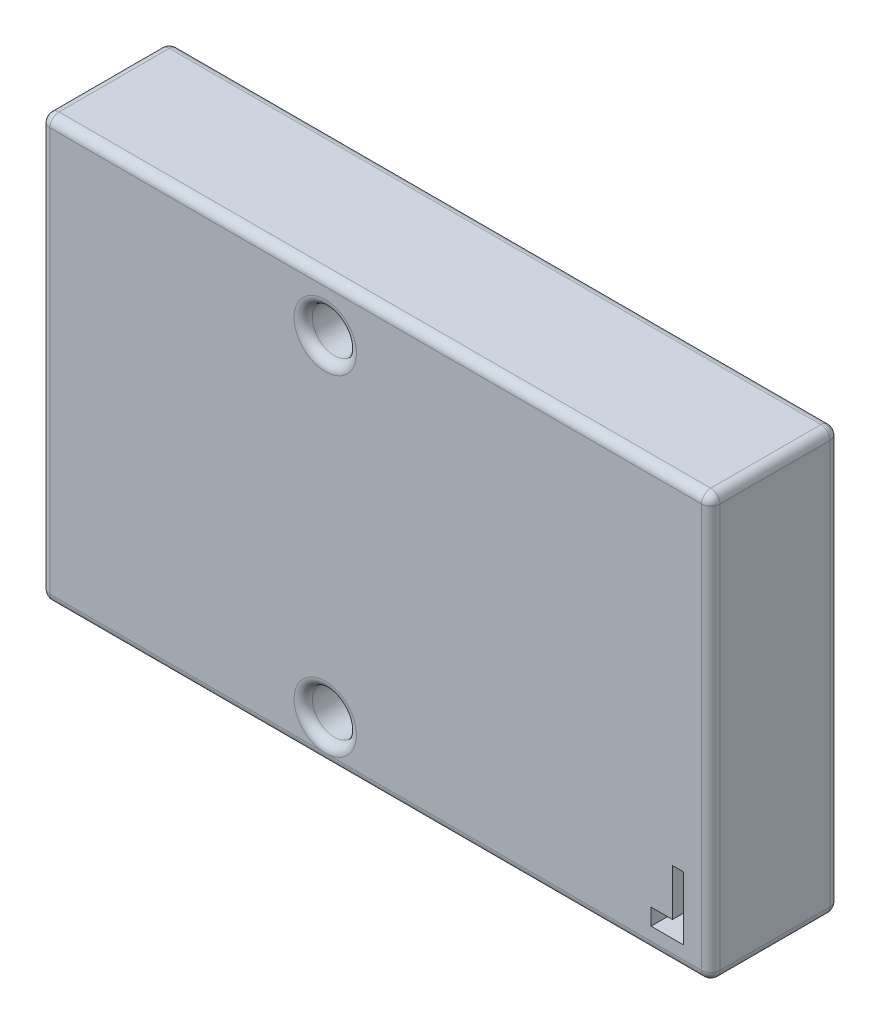
ISO-10303-21;
HEADER;
FILE_DESCRIPTION(('STEP AP214'),'2;1');
FILE_NAME('part.step','',(''),(''),'','','');
FILE_SCHEMA(('AUTOMOTIVE_DESIGN { 1 0 10303 214 1 1 1 1 }'));
ENDSEC;
DATA;
#1=APPLICATION_CONTEXT('core data for automotive mechanical design processes');
#2=APPLICATION_PROTOCOL_DEFINITION('international standard','automotive_design',2000,#1);
#3=PRODUCT_CONTEXT('',#1,'mechanical');
#4=PRODUCT('Part','Part','',(#3));
#5=PRODUCT_RELATED_PRODUCT_CATEGORY('part','',(#4));
#6=PRODUCT_DEFINITION_FORMATION('','',#4);
#7=PRODUCT_DEFINITION_CONTEXT('part definition',#1,'design');
#8=PRODUCT_DEFINITION('design','',#6,#7);
#9=PRODUCT_DEFINITION_SHAPE('','',#8);
#10=(LENGTH_UNIT() NAMED_UNIT(*) SI_UNIT(.MILLI.,.METRE.));
#11=(NAMED_UNIT(*) PLANE_ANGLE_UNIT() SI_UNIT($,.RADIAN.));
#12=(NAMED_UNIT(*) SI_UNIT($,.STERADIAN.) SOLID_ANGLE_UNIT());
#13=UNCERTAINTY_MEASURE_WITH_UNIT(LENGTH_MEASURE(1.E-05),#10,'distance_accuracy_value','');
#14=(GEOMETRIC_REPRESENTATION_CONTEXT(3) GLOBAL_UNCERTAINTY_ASSIGNED_CONTEXT((#13)) GLOBAL_UNIT_ASSIGNED_CONTEXT((#10,
#11,#12)) REPRESENTATION_CONTEXT('',''));
#15=CARTESIAN_POINT('',(0.,0.,0.));
#16=DIRECTION('',(0.,0.,1.));
#17=DIRECTION('',(1.,0.,0.));
#18=AXIS2_PLACEMENT_3D('',#15,#16,#17);
#19=CARTESIAN_POINT('',(0.,23.,7.));
#20=DIRECTION('',(1.,0.,0.));
#21=DIRECTION('',(0.,0.,-1.));
#22=AXIS2_PLACEMENT_3D('',#19,#20,#21);
#23=PLANE('',#22);
#24=DIRECTION('',(0.,0.,1.));
#25=VECTOR('',#24,1.);
#26=CARTESIAN_POINT('',(0.,22.5,7.));
#27=LINE('',#26,#25);
#28=CARTESIAN_POINT('',(0.,22.5,6.5));
#29=VERTEX_POINT('',#28);
#30=CARTESIAN_POINT('',(0.,22.5,0.5));
#31=VERTEX_POINT('',#30);
#32=EDGE_CURVE('E423',#29,#31,#27,.F.);
#33=ORIENTED_EDGE('',*,*,#32,.T.);
#34=DIRECTION('',(0.,-1.,0.));
#35=VECTOR('',#34,1.);
#36=CARTESIAN_POINT('',(0.,23.,0.5));
#37=LINE('',#36,#35);
#38=CARTESIAN_POINT('',(0.,0.5,0.5));
#39=VERTEX_POINT('',#38);
#40=EDGE_CURVE('E426',#31,#39,#37,.T.);
#41=ORIENTED_EDGE('',*,*,#40,.T.);
#42=DIRECTION('',(0.,0.,1.));
#43=VECTOR('',#42,1.);
#44=CARTESIAN_POINT('',(0.,0.5,7.));
#45=LINE('',#44,#43);
#46=CARTESIAN_POINT('',(0.,0.5,6.5));
#47=VERTEX_POINT('',#46);
#48=EDGE_CURVE('E417',#39,#47,#45,.T.);
#49=ORIENTED_EDGE('',*,*,#48,.T.);
#50=DIRECTION('',(0.,-1.,0.));
#51=VECTOR('',#50,1.);
#52=CARTESIAN_POINT('',(0.,23.,6.5));
#53=LINE('',#52,#51);
#54=EDGE_CURVE('E420',#47,#29,#53,.F.);
#55=ORIENTED_EDGE('',*,*,#54,.T.);
#56=EDGE_LOOP('',(#33,#41,#49,#55));
#57=FACE_BOUND('',#56,.T.);
#58=ADVANCED_FACE('F141',(#57),#23,.F.);
#59=CARTESIAN_POINT('',(36.5,23.,7.));
#60=DIRECTION('',(0.,0.,-1.));
#61=DIRECTION('',(-1.,0.,0.));
#62=AXIS2_PLACEMENT_3D('',#59,#60,#61);
#63=PLANE('',#62);
#64=DIRECTION('',(0.,1.,0.));
#65=VECTOR('',#64,1.);
#66=CARTESIAN_POINT('',(34.4160452150998,2.10745419475661,7.));
#67=LINE('',#66,#65);
#68=CARTESIAN_POINT('',(34.4160452150998,2.10745419475661,7.));
#69=VERTEX_POINT('',#68);
#70=CARTESIAN_POINT('',(34.4160452150998,4.65210946009639,7.));
#71=VERTEX_POINT('',#70);
#72=EDGE_CURVE('E290',#69,#71,#67,.T.);
#73=ORIENTED_EDGE('',*,*,#72,.T.);
#74=DIRECTION('',(1.,0.,0.));
#75=VECTOR('',#74,1.);
#76=CARTESIAN_POINT('',(34.4160452150998,4.65210946009639,7.));
#77=LINE('',#76,#75);
#78=CARTESIAN_POINT('',(35.0147876304738,4.65210946009639,7.));
#79=VERTEX_POINT('',#78);
#80=EDGE_CURVE('E283',#71,#79,#77,.T.);
#81=ORIENTED_EDGE('',*,*,#80,.T.);
#82=DIRECTION('',(0.,-1.,0.));
#83=VECTOR('',#82,1.);
#84=CARTESIAN_POINT('',(35.0147876304738,4.65210946009639,7.));
#85=LINE('',#84,#83);
#86=CARTESIAN_POINT('',(35.0147876304738,1.20934057169552,7.));
#87=VERTEX_POINT('',#86);
#88=EDGE_CURVE('E293',#79,#87,#85,.T.);
#89=ORIENTED_EDGE('',*,*,#88,.T.);
#90=DIRECTION('',(-1.,0.,0.));
#91=VECTOR('',#90,1.);
#92=CARTESIAN_POINT('',(35.0147876304738,1.20934057169551,7.));
#93=LINE('',#92,#91);
#94=CARTESIAN_POINT('',(33.2484975051203,1.20934057169551,7.));
#95=VERTEX_POINT('',#94);
#96=EDGE_CURVE('E159',#87,#95,#93,.T.);
#97=ORIENTED_EDGE('',*,*,#96,.T.);
#98=DIRECTION('',(0.,1.,0.));
#99=VECTOR('',#98,1.);
#100=CARTESIAN_POINT('',(33.2484975051203,1.20934057169551,7.));
#101=LINE('',#100,#99);
#102=CARTESIAN_POINT('',(33.2484975051203,2.10745419475661,7.));
#103=VERTEX_POINT('',#102);
#104=EDGE_CURVE('E312',#95,#103,#101,.T.);
#105=ORIENTED_EDGE('',*,*,#104,.T.);
#106=DIRECTION('',(1.,0.,0.));
#107=VECTOR('',#106,1.);
#108=CARTESIAN_POINT('',(33.2484975051203,2.10745419475661,7.));
#109=LINE('',#108,#107);
#110=EDGE_CURVE('E316',#103,#69,#109,.T.);
#111=ORIENTED_EDGE('',*,*,#110,.T.);
#112=EDGE_LOOP('',(#73,#81,#89,#97,#105,#111));
#113=FACE_BOUND('',#112,.T.);
#114=CARTESIAN_POINT('',(15.5,20.2,7.));
#115=DIRECTION('',(0.,0.,-1.));
#116=DIRECTION('',(-1.,0.,0.));
#117=AXIS2_PLACEMENT_3D('',#114,#115,#116);
#118=CIRCLE('',#117,1.7);
#119=CARTESIAN_POINT('',(13.8,20.2,7.));
#120=VERTEX_POINT('',#119);
#121=EDGE_CURVE('E467',#120,#120,#118,.T.);
#122=ORIENTED_EDGE('',*,*,#121,.T.);
#123=EDGE_LOOP('',(#122));
#124=FACE_BOUND('',#123,.T.);
#125=CARTESIAN_POINT('',(15.5,2.2,7.));
#126=DIRECTION('',(0.,0.,-1.));
#127=DIRECTION('',(-1.,0.,0.));
#128=AXIS2_PLACEMENT_3D('',#125,#126,#127);
#129=CIRCLE('',#128,1.7);
#130=CARTESIAN_POINT('',(15.5,0.5,7.));
#131=VERTEX_POINT('',#130);
#132=CARTESIAN_POINT('',(13.8,2.2,7.));
#133=VERTEX_POINT('',#132);
#134=EDGE_CURVE('E460',#131,#133,#129,.T.);
#135=ORIENTED_EDGE('',*,*,#134,.T.);
#136=CARTESIAN_POINT('',(15.5,2.2,7.));
#137=DIRECTION('',(0.,0.,-1.));
#138=DIRECTION('',(-1.,0.,0.));
#139=AXIS2_PLACEMENT_3D('',#136,#137,#138);
#140=CIRCLE('',#139,1.7);
#141=EDGE_CURVE('E463',#133,#131,#140,.T.);
#142=ORIENTED_EDGE('',*,*,#141,.T.);
#143=DIRECTION('',(1.,0.,0.));
#144=VECTOR('',#143,1.);
#145=CARTESIAN_POINT('',(36.5,0.5,7.));
#146=LINE('',#145,#144);
#147=CARTESIAN_POINT('',(36.,0.5,7.));
#148=VERTEX_POINT('',#147);
#149=EDGE_CURVE('E443',#131,#148,#146,.T.);
#150=ORIENTED_EDGE('',*,*,#149,.T.);
#151=DIRECTION('',(0.,-1.,0.));
#152=VECTOR('',#151,1.);
#153=CARTESIAN_POINT('',(36.,23.,7.));
#154=LINE('',#153,#152);
#155=CARTESIAN_POINT('',(36.,22.5,7.));
#156=VERTEX_POINT('',#155);
#157=EDGE_CURVE('E450',#148,#156,#154,.F.);
#158=ORIENTED_EDGE('',*,*,#157,.T.);
#159=DIRECTION('',(1.,0.,0.));
#160=VECTOR('',#159,1.);
#161=CARTESIAN_POINT('',(36.5,22.5,7.));
#162=LINE('',#161,#160);
#163=CARTESIAN_POINT('',(0.5,22.5,7.));
#164=VERTEX_POINT('',#163);
#165=EDGE_CURVE('E453',#156,#164,#162,.F.);
#166=ORIENTED_EDGE('',*,*,#165,.T.);
#167=DIRECTION('',(0.,-1.,0.));
#168=VECTOR('',#167,1.);
#169=CARTESIAN_POINT('',(0.5,23.,7.));
#170=LINE('',#169,#168);
#171=CARTESIAN_POINT('',(0.5,0.5,7.));
#172=VERTEX_POINT('',#171);
#173=EDGE_CURVE('E456',#164,#172,#170,.T.);
#174=ORIENTED_EDGE('',*,*,#173,.T.);
#175=DIRECTION('',(1.,0.,0.));
#176=VECTOR('',#175,1.);
#177=CARTESIAN_POINT('',(36.5,0.5,7.));
#178=LINE('',#177,#176);
#179=EDGE_CURVE('E446',#172,#131,#178,.T.);
#180=ORIENTED_EDGE('',*,*,#179,.T.);
#181=EDGE_LOOP('',(#135,#142,#150,#158,#166,#174,#180));
#182=FACE_BOUND('',#181,.T.);
#183=ADVANCED_FACE('F298',(#113,#124,#182),#63,.F.);
#184=CARTESIAN_POINT('',(36.5,23.,0.));
#185=DIRECTION('',(-1.,0.,0.));
#186=DIRECTION('',(0.,0.,1.));
#187=AXIS2_PLACEMENT_3D('',#184,#185,#186);
#188=PLANE('',#187);
#189=DIRECTION('',(0.,-1.,0.));
#190=VECTOR('',#189,1.);
#191=CARTESIAN_POINT('',(36.5,23.,0.5));
#192=LINE('',#191,#190);
#193=CARTESIAN_POINT('',(36.5,0.5,0.5));
#194=VERTEX_POINT('',#193);
#195=CARTESIAN_POINT('',(36.5,22.5,0.5));
#196=VERTEX_POINT('',#195);
#197=EDGE_CURVE('E436',#194,#196,#192,.F.);
#198=ORIENTED_EDGE('',*,*,#197,.T.);
#199=DIRECTION('',(0.,0.,-1.));
#200=VECTOR('',#199,1.);
#201=CARTESIAN_POINT('',(36.5,22.5,0.));
#202=LINE('',#201,#200);
#203=CARTESIAN_POINT('',(36.5,22.5,6.5));
#204=VERTEX_POINT('',#203);
#205=EDGE_CURVE('E439',#196,#204,#202,.F.);
#206=ORIENTED_EDGE('',*,*,#205,.T.);
#207=DIRECTION('',(0.,-1.,0.));
#208=VECTOR('',#207,1.);
#209=CARTESIAN_POINT('',(36.5,23.,6.5));
#210=LINE('',#209,#208);
#211=CARTESIAN_POINT('',(36.5,0.5,6.5));
#212=VERTEX_POINT('',#211);
#213=EDGE_CURVE('E433',#204,#212,#210,.T.);
#214=ORIENTED_EDGE('',*,*,#213,.T.);
#215=DIRECTION('',(0.,0.,-1.));
#216=VECTOR('',#215,1.);
#217=CARTESIAN_POINT('',(36.5,0.5,0.));
#218=LINE('',#217,#216);
#219=EDGE_CURVE('E430',#212,#194,#218,.T.);
#220=ORIENTED_EDGE('',*,*,#219,.T.);
#221=EDGE_LOOP('',(#198,#206,#214,#220));
#222=FACE_BOUND('',#221,.T.);
#223=ADVANCED_FACE('F603',(#222),#188,.F.);
#224=CARTESIAN_POINT('',(0.,23.,0.));
#225=DIRECTION('',(0.,0.,1.));
#226=DIRECTION('',(1.,0.,0.));
#227=AXIS2_PLACEMENT_3D('',#224,#225,#226);
#228=PLANE('',#227);
#229=DIRECTION('',(0.,-1.,0.));
#230=VECTOR('',#229,1.);
#231=CARTESIAN_POINT('',(35.0147876304738,4.65210946009639,0.));
#232=LINE('',#231,#230);
#233=CARTESIAN_POINT('',(35.0147876304738,4.65210946009639,0.));
#234=VERTEX_POINT('',#233);
#235=CARTESIAN_POINT('',(35.0147876304738,1.20934057169551,0.));
#236=VERTEX_POINT('',#235);
#237=EDGE_CURVE('E323',#234,#236,#232,.T.);
#238=ORIENTED_EDGE('',*,*,#237,.F.);
#239=DIRECTION('',(1.,0.,0.));
#240=VECTOR('',#239,1.);
#241=CARTESIAN_POINT('',(34.4160452150998,4.65210946009639,0.));
#242=LINE('',#241,#240);
#243=CARTESIAN_POINT('',(34.4160452150998,4.65210946009639,0.));
#244=VERTEX_POINT('',#243);
#245=EDGE_CURVE('E167',#244,#234,#242,.T.);
#246=ORIENTED_EDGE('',*,*,#245,.F.);
#247=DIRECTION('',(0.,1.,0.));
#248=VECTOR('',#247,1.);
#249=CARTESIAN_POINT('',(34.4160452150998,2.10745419475661,0.));
#250=LINE('',#249,#248);
#251=CARTESIAN_POINT('',(34.4160452150998,2.10745419475661,0.));
#252=VERTEX_POINT('',#251);
#253=EDGE_CURVE('E303',#252,#244,#250,.T.);
#254=ORIENTED_EDGE('',*,*,#253,.F.);
#255=DIRECTION('',(1.,0.,0.));
#256=VECTOR('',#255,1.);
#257=CARTESIAN_POINT('',(33.2484975051203,2.10745419475661,0.));
#258=LINE('',#257,#256);
#259=CARTESIAN_POINT('',(33.2484975051203,2.10745419475661,0.));
#260=VERTEX_POINT('',#259);
#261=EDGE_CURVE('E307',#260,#252,#258,.T.);
#262=ORIENTED_EDGE('',*,*,#261,.F.);
#263=DIRECTION('',(0.,1.,0.));
#264=VECTOR('',#263,1.);
#265=CARTESIAN_POINT('',(33.2484975051203,1.20934057169551,0.));
#266=LINE('',#265,#264);
#267=CARTESIAN_POINT('',(33.2484975051203,1.20934057169551,0.));
#268=VERTEX_POINT('',#267);
#269=EDGE_CURVE('E330',#268,#260,#266,.T.);
#270=ORIENTED_EDGE('',*,*,#269,.F.);
#271=DIRECTION('',(-1.,0.,0.));
#272=VECTOR('',#271,1.);
#273=CARTESIAN_POINT('',(35.0147876304738,1.20934057169551,0.));
#274=LINE('',#273,#272);
#275=EDGE_CURVE('E326',#236,#268,#274,.T.);
#276=ORIENTED_EDGE('',*,*,#275,.F.);
#277=EDGE_LOOP('',(#238,#246,#254,#262,#270,#276));
#278=FACE_BOUND('',#277,.T.);
#279=CARTESIAN_POINT('',(15.5,20.2,0.));
#280=DIRECTION('',(0.,0.,1.));
#281=DIRECTION('',(1.,0.,0.));
#282=AXIS2_PLACEMENT_3D('',#279,#280,#281);
#283=CIRCLE('',#282,1.7);
#284=CARTESIAN_POINT('',(17.2,20.2,0.));
#285=VERTEX_POINT('',#284);
#286=EDGE_CURVE('E397',#285,#285,#283,.T.);
#287=ORIENTED_EDGE('',*,*,#286,.T.);
#288=EDGE_LOOP('',(#287));
#289=FACE_BOUND('',#288,.T.);
#290=CARTESIAN_POINT('',(15.5,2.2,0.));
#291=DIRECTION('',(0.,0.,1.));
#292=DIRECTION('',(1.,0.,0.));
#293=AXIS2_PLACEMENT_3D('',#290,#291,#292);
#294=CIRCLE('',#293,1.7);
#295=CARTESIAN_POINT('',(15.5,0.5,0.));
#296=VERTEX_POINT('',#295);
#297=CARTESIAN_POINT('',(13.8,2.2,0.));
#298=VERTEX_POINT('',#297);
#299=EDGE_CURVE('E390',#296,#298,#294,.T.);
#300=ORIENTED_EDGE('',*,*,#299,.T.);
#301=CARTESIAN_POINT('',(15.5,2.2,0.));
#302=DIRECTION('',(0.,0.,1.));
#303=DIRECTION('',(1.,0.,0.));
#304=AXIS2_PLACEMENT_3D('',#301,#302,#303);
#305=CIRCLE('',#304,1.7);
#306=EDGE_CURVE('E393',#298,#296,#305,.T.);
#307=ORIENTED_EDGE('',*,*,#306,.T.);
#308=DIRECTION('',(-1.,0.,0.));
#309=VECTOR('',#308,1.);
#310=CARTESIAN_POINT('',(0.,0.5,0.));
#311=LINE('',#310,#309);
#312=CARTESIAN_POINT('',(0.5,0.5,0.));
#313=VERTEX_POINT('',#312);
#314=EDGE_CURVE('E373',#296,#313,#311,.T.);
#315=ORIENTED_EDGE('',*,*,#314,.T.);
#316=DIRECTION('',(0.,-1.,0.));
#317=VECTOR('',#316,1.);
#318=CARTESIAN_POINT('',(0.5,23.,0.));
#319=LINE('',#318,#317);
#320=CARTESIAN_POINT('',(0.5,22.5,0.));
#321=VERTEX_POINT('',#320);
#322=EDGE_CURVE('E383',#313,#321,#319,.F.);
#323=ORIENTED_EDGE('',*,*,#322,.T.);
#324=DIRECTION('',(-1.,0.,0.));
#325=VECTOR('',#324,1.);
#326=CARTESIAN_POINT('',(0.,22.5,0.));
#327=LINE('',#326,#325);
#328=CARTESIAN_POINT('',(36.,22.5,0.));
#329=VERTEX_POINT('',#328);
#330=EDGE_CURVE('E386',#321,#329,#327,.F.);
#331=ORIENTED_EDGE('',*,*,#330,.T.);
#332=DIRECTION('',(0.,-1.,0.));
#333=VECTOR('',#332,1.);
#334=CARTESIAN_POINT('',(36.,23.,0.));
#335=LINE('',#334,#333);
#336=CARTESIAN_POINT('',(36.,0.5,0.));
#337=VERTEX_POINT('',#336);
#338=EDGE_CURVE('E380',#329,#337,#335,.T.);
#339=ORIENTED_EDGE('',*,*,#338,.T.);
#340=DIRECTION('',(-1.,0.,0.));
#341=VECTOR('',#340,1.);
#342=CARTESIAN_POINT('',(0.,0.5,0.));
#343=LINE('',#342,#341);
#344=EDGE_CURVE('E376',#337,#296,#343,.T.);
#345=ORIENTED_EDGE('',*,*,#344,.T.);
#346=EDGE_LOOP('',(#300,#307,#315,#323,#331,#339,#345));
#347=FACE_BOUND('',#346,.T.);
#348=ADVANCED_FACE('F729',(#278,#289,#347),#228,.F.);
#349=CARTESIAN_POINT('',(0.,23.,0.));
#350=DIRECTION('',(0.,-1.,0.));
#351=DIRECTION('',(0.,0.,-1.));
#352=AXIS2_PLACEMENT_3D('',#349,#350,#351);
#353=PLANE('',#352);
#354=DIRECTION('',(0.,0.,-1.));
#355=VECTOR('',#354,1.);
#356=CARTESIAN_POINT('',(36.,23.,0.));
#357=LINE('',#356,#355);
#358=CARTESIAN_POINT('',(36.,23.,6.5));
#359=VERTEX_POINT('',#358);
#360=CARTESIAN_POINT('',(36.,23.,0.5));
#361=VERTEX_POINT('',#360);
#362=EDGE_CURVE('E363',#359,#361,#357,.T.);
#363=ORIENTED_EDGE('',*,*,#362,.T.);
#364=DIRECTION('',(-1.,0.,0.));
#365=VECTOR('',#364,1.);
#366=CARTESIAN_POINT('',(0.,23.,0.5));
#367=LINE('',#366,#365);
#368=CARTESIAN_POINT('',(0.5,23.,0.5));
#369=VERTEX_POINT('',#368);
#370=EDGE_CURVE('E369',#361,#369,#367,.T.);
#371=ORIENTED_EDGE('',*,*,#370,.T.);
#372=DIRECTION('',(0.,0.,1.));
#373=VECTOR('',#372,1.);
#374=CARTESIAN_POINT('',(0.5,23.,0.));
#375=LINE('',#374,#373);
#376=CARTESIAN_POINT('',(0.5,23.,6.5));
#377=VERTEX_POINT('',#376);
#378=EDGE_CURVE('E366',#369,#377,#375,.T.);
#379=ORIENTED_EDGE('',*,*,#378,.T.);
#380=DIRECTION('',(1.,0.,0.));
#381=VECTOR('',#380,1.);
#382=CARTESIAN_POINT('',(0.,23.,6.5));
#383=LINE('',#382,#381);
#384=EDGE_CURVE('E356',#377,#359,#383,.T.);
#385=ORIENTED_EDGE('',*,*,#384,.T.);
#386=EDGE_LOOP('',(#363,#371,#379,#385));
#387=FACE_BOUND('',#386,.T.);
#388=ADVANCED_FACE('F738',(#387),#353,.F.);
#389=CARTESIAN_POINT('',(0.,0.,0.));
#390=DIRECTION('',(0.,-1.,0.));
#391=DIRECTION('',(0.,0.,-1.));
#392=AXIS2_PLACEMENT_3D('',#389,#390,#391);
#393=PLANE('',#392);
#394=DIRECTION('',(0.,0.,-1.));
#395=VECTOR('',#394,1.);
#396=CARTESIAN_POINT('',(36.,0.,7.));
#397=LINE('',#396,#395);
#398=CARTESIAN_POINT('',(36.,0.,0.5));
#399=VERTEX_POINT('',#398);
#400=CARTESIAN_POINT('',(36.,0.,6.5));
#401=VERTEX_POINT('',#400);
#402=EDGE_CURVE('E485',#399,#401,#397,.F.);
#403=ORIENTED_EDGE('',*,*,#402,.T.);
#404=DIRECTION('',(1.,0.,0.));
#405=VECTOR('',#404,1.);
#406=CARTESIAN_POINT('',(0.,0.,6.5));
#407=LINE('',#406,#405);
#408=CARTESIAN_POINT('',(0.5,0.,6.5));
#409=VERTEX_POINT('',#408);
#410=EDGE_CURVE('E488',#401,#409,#407,.F.);
#411=ORIENTED_EDGE('',*,*,#410,.T.);
#412=DIRECTION('',(0.,0.,1.));
#413=VECTOR('',#412,1.);
#414=CARTESIAN_POINT('',(0.5,0.,0.));
#415=LINE('',#414,#413);
#416=CARTESIAN_POINT('',(0.5,0.,0.5));
#417=VERTEX_POINT('',#416);
#418=EDGE_CURVE('E479',#409,#417,#415,.F.);
#419=ORIENTED_EDGE('',*,*,#418,.T.);
#420=DIRECTION('',(-1.,0.,0.));
#421=VECTOR('',#420,1.);
#422=CARTESIAN_POINT('',(36.5,0.,0.5));
#423=LINE('',#422,#421);
#424=EDGE_CURVE('E482',#417,#399,#423,.F.);
#425=ORIENTED_EDGE('',*,*,#424,.T.);
#426=EDGE_LOOP('',(#403,#411,#419,#425));
#427=FACE_BOUND('',#426,.T.);
#428=CARTESIAN_POINT('',(28.5,0.,3.));
#429=DIRECTION('',(0.,-1.,0.));
#430=DIRECTION('',(0.,0.,-1.));
#431=AXIS2_PLACEMENT_3D('',#428,#429,#430);
#432=CIRCLE('',#431,1.875);
#433=CARTESIAN_POINT('',(28.5,0.,1.125));
#434=VERTEX_POINT('',#433);
#435=EDGE_CURVE('E475',#434,#434,#432,.F.);
#436=ORIENTED_EDGE('',*,*,#435,.T.);
#437=EDGE_LOOP('',(#436));
#438=FACE_BOUND('',#437,.T.);
#439=CARTESIAN_POINT('',(8.,0.,3.));
#440=DIRECTION('',(0.,-1.,0.));
#441=DIRECTION('',(0.,0.,-1.));
#442=AXIS2_PLACEMENT_3D('',#439,#440,#441);
#443=CIRCLE('',#442,1.875);
#444=CARTESIAN_POINT('',(8.,0.,1.125));
#445=VERTEX_POINT('',#444);
#446=EDGE_CURVE('E471',#445,#445,#443,.F.);
#447=ORIENTED_EDGE('',*,*,#446,.T.);
#448=EDGE_LOOP('',(#447));
#449=FACE_BOUND('',#448,.T.);
#450=ADVANCED_FACE('F716',(#427,#438,#449),#393,.T.);
#451=CARTESIAN_POINT('',(28.5,8.5,3.));
#452=DIRECTION('',(0.,-1.,0.));
#453=DIRECTION('',(0.,0.,-1.));
#454=AXIS2_PLACEMENT_3D('',#451,#452,#453);
#455=CYLINDRICAL_SURFACE('',#454,1.375);
#456=CARTESIAN_POINT('',(28.5,0.5,3.));
#457=DIRECTION('',(0.,-1.,0.));
#458=DIRECTION('',(0.,0.,-1.));
#459=AXIS2_PLACEMENT_3D('',#456,#457,#458);
#460=CIRCLE('',#459,1.375);
#461=CARTESIAN_POINT('',(28.5,0.5,1.625));
#462=VERTEX_POINT('',#461);
#463=EDGE_CURVE('E151',#462,#462,#460,.T.);
#464=ORIENTED_EDGE('',*,*,#463,.T.);
#465=EDGE_LOOP('',(#464));
#466=FACE_BOUND('',#465,.T.);
#467=CARTESIAN_POINT('',(28.5,8.5,3.));
#468=DIRECTION('',(0.,-1.,0.));
#469=DIRECTION('',(0.,0.,-1.));
#470=AXIS2_PLACEMENT_3D('',#467,#468,#469);
#471=CIRCLE('',#470,1.375);
#472=CARTESIAN_POINT('',(28.5,8.5,1.625));
#473=VERTEX_POINT('',#472);
#474=EDGE_CURVE('E357',#473,#473,#471,.T.);
#475=ORIENTED_EDGE('',*,*,#474,.F.);
#476=EDGE_LOOP('',(#475));
#477=FACE_BOUND('',#476,.T.);
#478=ADVANCED_FACE('F748',(#466,#477),#455,.F.);
#479=CARTESIAN_POINT('',(28.5,8.5,3.));
#480=DIRECTION('',(0.,-1.,0.));
#481=DIRECTION('',(0.,0.,-1.));
#482=AXIS2_PLACEMENT_3D('',#479,#480,#481);
#483=PLANE('',#482);
#484=ORIENTED_EDGE('',*,*,#474,.T.);
#485=EDGE_LOOP('',(#484));
#486=FACE_BOUND('',#485,.T.);
#487=ADVANCED_FACE('F837',(#486),#483,.T.);
#488=CARTESIAN_POINT('',(8.,8.5,3.));
#489=DIRECTION('',(0.,-1.,0.));
#490=DIRECTION('',(0.,0.,-1.));
#491=AXIS2_PLACEMENT_3D('',#488,#489,#490);
#492=CYLINDRICAL_SURFACE('',#491,1.375);
#493=CARTESIAN_POINT('',(8.,0.5,3.));
#494=DIRECTION('',(0.,-1.,0.));
#495=DIRECTION('',(0.,0.,-1.));
#496=AXIS2_PLACEMENT_3D('',#493,#494,#495);
#497=CIRCLE('',#496,1.375);
#498=CARTESIAN_POINT('',(8.,0.5,1.625));
#499=VERTEX_POINT('',#498);
#500=EDGE_CURVE('E12',#499,#499,#497,.T.);
#501=ORIENTED_EDGE('',*,*,#500,.T.);
#502=EDGE_LOOP('',(#501));
#503=FACE_BOUND('',#502,.T.);
#504=CARTESIAN_POINT('',(8.,8.5,3.));
#505=DIRECTION('',(0.,-1.,0.));
#506=DIRECTION('',(0.,0.,-1.));
#507=AXIS2_PLACEMENT_3D('',#504,#505,#506);
#508=CIRCLE('',#507,1.375);
#509=CARTESIAN_POINT('',(8.,8.5,1.625));
#510=VERTEX_POINT('',#509);
#511=EDGE_CURVE('E352',#510,#510,#508,.T.);
#512=ORIENTED_EDGE('',*,*,#511,.F.);
#513=EDGE_LOOP('',(#512));
#514=FACE_BOUND('',#513,.T.);
#515=ADVANCED_FACE('F834',(#503,#514),#492,.F.);
#516=CARTESIAN_POINT('',(8.,8.5,3.));
#517=DIRECTION('',(0.,-1.,0.));
#518=DIRECTION('',(0.,0.,-1.));
#519=AXIS2_PLACEMENT_3D('',#516,#517,#518);
#520=PLANE('',#519);
#521=ORIENTED_EDGE('',*,*,#511,.T.);
#522=EDGE_LOOP('',(#521));
#523=FACE_BOUND('',#522,.T.);
#524=ADVANCED_FACE('F830',(#523),#520,.T.);
#525=CARTESIAN_POINT('',(15.5,20.2,7.));
#526=DIRECTION('',(0.,0.,-1.));
#527=DIRECTION('',(-1.,0.,0.));
#528=AXIS2_PLACEMENT_3D('',#525,#526,#527);
#529=CYLINDRICAL_SURFACE('',#528,1.2);
#530=CARTESIAN_POINT('',(15.5,20.2,0.5));
#531=DIRECTION('',(0.,0.,1.));
#532=DIRECTION('',(1.,0.,0.));
#533=AXIS2_PLACEMENT_3D('',#530,#531,#532);
#534=CIRCLE('',#533,1.2);
#535=CARTESIAN_POINT('',(16.7,20.2,0.5));
#536=VERTEX_POINT('',#535);
#537=EDGE_CURVE('E405',#536,#536,#534,.F.);
#538=ORIENTED_EDGE('',*,*,#537,.T.);
#539=EDGE_LOOP('',(#538));
#540=FACE_BOUND('',#539,.T.);
#541=CARTESIAN_POINT('',(15.5,20.2,6.5));
#542=DIRECTION('',(0.,0.,-1.));
#543=DIRECTION('',(-1.,0.,0.));
#544=AXIS2_PLACEMENT_3D('',#541,#542,#543);
#545=CIRCLE('',#544,1.2);
#546=CARTESIAN_POINT('',(14.3,20.2,6.5));
#547=VERTEX_POINT('',#546);
#548=EDGE_CURVE('E401',#547,#547,#545,.F.);
#549=ORIENTED_EDGE('',*,*,#548,.T.);
#550=EDGE_LOOP('',(#549));
#551=FACE_BOUND('',#550,.T.);
#552=ADVANCED_FACE('F638',(#540,#551),#529,.F.);
#553=CARTESIAN_POINT('',(15.5,2.2,7.));
#554=DIRECTION('',(0.,0.,-1.));
#555=DIRECTION('',(-1.,0.,0.));
#556=AXIS2_PLACEMENT_3D('',#553,#554,#555);
#557=CYLINDRICAL_SURFACE('',#556,1.2);
#558=CARTESIAN_POINT('',(15.5,2.2,0.5));
#559=DIRECTION('',(0.,0.,1.));
#560=DIRECTION('',(1.,0.,0.));
#561=AXIS2_PLACEMENT_3D('',#558,#559,#560);
#562=CIRCLE('',#561,1.2);
#563=CARTESIAN_POINT('',(16.7,2.2,0.5));
#564=VERTEX_POINT('',#563);
#565=EDGE_CURVE('E413',#564,#564,#562,.F.);
#566=ORIENTED_EDGE('',*,*,#565,.T.);
#567=EDGE_LOOP('',(#566));
#568=FACE_BOUND('',#567,.T.);
#569=CARTESIAN_POINT('',(15.5,2.2,6.5));
#570=DIRECTION('',(0.,0.,-1.));
#571=DIRECTION('',(-1.,0.,0.));
#572=AXIS2_PLACEMENT_3D('',#569,#570,#571);
#573=CIRCLE('',#572,1.2);
#574=CARTESIAN_POINT('',(14.3,2.2,6.5));
#575=VERTEX_POINT('',#574);
#576=EDGE_CURVE('E409',#575,#575,#573,.F.);
#577=ORIENTED_EDGE('',*,*,#576,.T.);
#578=EDGE_LOOP('',(#577));
#579=FACE_BOUND('',#578,.T.);
#580=ADVANCED_FACE('F630',(#568,#579),#557,.F.);
#581=CARTESIAN_POINT('',(36.5,0.5,6.5));
#582=DIRECTION('',(-1.,0.,0.));
#583=DIRECTION('',(0.,0.,1.));
#584=AXIS2_PLACEMENT_3D('',#581,#582,#583);
#585=CYLINDRICAL_SURFACE('',#584,0.5);
#586=CARTESIAN_POINT('',(36.,0.5,6.5));
#587=DIRECTION('',(1.,0.,0.));
#588=DIRECTION('',(0.,0.,-1.));
#589=AXIS2_PLACEMENT_3D('',#586,#587,#588);
#590=CIRCLE('',#589,0.5);
#591=EDGE_CURVE('E145',#148,#401,#590,.T.);
#592=ORIENTED_EDGE('',*,*,#591,.F.);
#593=ORIENTED_EDGE('',*,*,#149,.F.);
#594=ORIENTED_EDGE('',*,*,#179,.F.);
#595=CARTESIAN_POINT('',(0.5,0.5,6.5));
#596=DIRECTION('',(-1.,0.,0.));
#597=DIRECTION('',(0.,0.,1.));
#598=AXIS2_PLACEMENT_3D('',#595,#596,#597);
#599=CIRCLE('',#598,0.5);
#600=EDGE_CURVE('E576',#409,#172,#599,.T.);
#601=ORIENTED_EDGE('',*,*,#600,.F.);
#602=ORIENTED_EDGE('',*,*,#410,.F.);
#603=EDGE_LOOP('',(#592,#593,#594,#601,#602));
#604=FACE_BOUND('',#603,.T.);
#605=ADVANCED_FACE('F628',(#604),#585,.T.);
#606=CARTESIAN_POINT('',(36.,0.5,6.5));
#607=DIRECTION('',(0.,0.,1.));
#608=DIRECTION('',(1.,0.,0.));
#609=AXIS2_PLACEMENT_3D('',#606,#607,#608);
#610=SPHERICAL_SURFACE('',#609,0.5);
#611=CARTESIAN_POINT('',(36.,0.5,6.5));
#612=DIRECTION('',(0.,-1.,0.));
#613=DIRECTION('',(0.,0.,-1.));
#614=AXIS2_PLACEMENT_3D('',#611,#612,#613);
#615=CIRCLE('',#614,0.5);
#616=EDGE_CURVE('E569',#148,#212,#615,.F.);
#617=ORIENTED_EDGE('',*,*,#616,.F.);
#618=ORIENTED_EDGE('',*,*,#591,.T.);
#619=CARTESIAN_POINT('',(36.,0.5,6.5));
#620=DIRECTION('',(0.,0.,1.));
#621=DIRECTION('',(1.,0.,0.));
#622=AXIS2_PLACEMENT_3D('',#619,#620,#621);
#623=CIRCLE('',#622,0.5);
#624=EDGE_CURVE('E573',#212,#401,#623,.F.);
#625=ORIENTED_EDGE('',*,*,#624,.F.);
#626=EDGE_LOOP('',(#617,#618,#625));
#627=FACE_BOUND('',#626,.T.);
#628=ADVANCED_FACE('F590',(#627),#610,.T.);
#629=CARTESIAN_POINT('',(0.5,0.5,6.5));
#630=DIRECTION('',(0.,0.,1.));
#631=DIRECTION('',(1.,0.,0.));
#632=AXIS2_PLACEMENT_3D('',#629,#630,#631);
#633=SPHERICAL_SURFACE('',#632,0.5);
#634=CARTESIAN_POINT('',(0.5,0.5,6.5));
#635=DIRECTION('',(0.,0.,1.));
#636=DIRECTION('',(1.,0.,0.));
#637=AXIS2_PLACEMENT_3D('',#634,#635,#636);
#638=CIRCLE('',#637,0.5);
#639=EDGE_CURVE('E562',#409,#47,#638,.F.);
#640=ORIENTED_EDGE('',*,*,#639,.F.);
#641=ORIENTED_EDGE('',*,*,#600,.T.);
#642=CARTESIAN_POINT('',(0.5,0.5,6.5));
#643=DIRECTION('',(0.,-1.,0.));
#644=DIRECTION('',(0.,0.,-1.));
#645=AXIS2_PLACEMENT_3D('',#642,#643,#644);
#646=CIRCLE('',#645,0.5);
#647=EDGE_CURVE('E566',#47,#172,#646,.F.);
#648=ORIENTED_EDGE('',*,*,#647,.F.);
#649=EDGE_LOOP('',(#640,#641,#648));
#650=FACE_BOUND('',#649,.T.);
#651=ADVANCED_FACE('F636',(#650),#633,.T.);
#652=CARTESIAN_POINT('',(36.,0.5,0.));
#653=DIRECTION('',(0.,0.,1.));
#654=DIRECTION('',(1.,0.,0.));
#655=AXIS2_PLACEMENT_3D('',#652,#653,#654);
#656=CYLINDRICAL_SURFACE('',#655,0.5);
#657=ORIENTED_EDGE('',*,*,#624,.T.);
#658=ORIENTED_EDGE('',*,*,#402,.F.);
#659=CARTESIAN_POINT('',(36.,0.5,0.5));
#660=DIRECTION('',(0.,0.,-1.));
#661=DIRECTION('',(-1.,0.,0.));
#662=AXIS2_PLACEMENT_3D('',#659,#660,#661);
#663=CIRCLE('',#662,0.5);
#664=EDGE_CURVE('E554',#194,#399,#663,.T.);
#665=ORIENTED_EDGE('',*,*,#664,.F.);
#666=ORIENTED_EDGE('',*,*,#219,.F.);
#667=EDGE_LOOP('',(#657,#658,#665,#666));
#668=FACE_BOUND('',#667,.T.);
#669=ADVANCED_FACE('F598',(#668),#656,.T.);
#670=CARTESIAN_POINT('',(36.,23.,6.5));
#671=DIRECTION('',(0.,-1.,0.));
#672=DIRECTION('',(0.,0.,-1.));
#673=AXIS2_PLACEMENT_3D('',#670,#671,#672);
#674=CYLINDRICAL_SURFACE('',#673,0.5);
#675=ORIENTED_EDGE('',*,*,#616,.T.);
#676=ORIENTED_EDGE('',*,*,#213,.F.);
#677=CARTESIAN_POINT('',(36.,22.5,6.5));
#678=DIRECTION('',(0.,1.,0.));
#679=DIRECTION('',(0.,0.,1.));
#680=AXIS2_PLACEMENT_3D('',#677,#678,#679);
#681=CIRCLE('',#680,0.5);
#682=EDGE_CURVE('E550',#156,#204,#681,.T.);
#683=ORIENTED_EDGE('',*,*,#682,.F.);
#684=ORIENTED_EDGE('',*,*,#157,.F.);
#685=EDGE_LOOP('',(#675,#676,#683,#684));
#686=FACE_BOUND('',#685,.T.);
#687=ADVANCED_FACE('F609',(#686),#674,.T.);
#688=CARTESIAN_POINT('',(0.,22.5,6.5));
#689=DIRECTION('',(1.,0.,0.));
#690=DIRECTION('',(0.,0.,-1.));
#691=AXIS2_PLACEMENT_3D('',#688,#689,#690);
#692=CYLINDRICAL_SURFACE('',#691,0.5);
#693=CARTESIAN_POINT('',(0.5,22.5,6.5));
#694=DIRECTION('',(-1.,0.,0.));
#695=DIRECTION('',(0.,-1.,0.));
#696=AXIS2_PLACEMENT_3D('',#693,#694,#695);
#697=CIRCLE('',#696,0.5);
#698=EDGE_CURVE('E542',#164,#377,#697,.T.);
#699=ORIENTED_EDGE('',*,*,#698,.F.);
#700=ORIENTED_EDGE('',*,*,#165,.F.);
#701=CARTESIAN_POINT('',(36.,22.5,6.5));
#702=DIRECTION('',(1.,0.,0.));
#703=DIRECTION('',(0.,0.,-1.));
#704=AXIS2_PLACEMENT_3D('',#701,#702,#703);
#705=CIRCLE('',#704,0.5);
#706=EDGE_CURVE('E546',#359,#156,#705,.T.);
#707=ORIENTED_EDGE('',*,*,#706,.F.);
#708=ORIENTED_EDGE('',*,*,#384,.F.);
#709=EDGE_LOOP('',(#699,#700,#707,#708));
#710=FACE_BOUND('',#709,.T.);
#711=ADVANCED_FACE('F616',(#710),#692,.T.);
#712=CARTESIAN_POINT('',(0.5,23.,6.5));
#713=DIRECTION('',(0.,-1.,0.));
#714=DIRECTION('',(0.,0.,-1.));
#715=AXIS2_PLACEMENT_3D('',#712,#713,#714);
#716=CYLINDRICAL_SURFACE('',#715,0.5);
#717=ORIENTED_EDGE('',*,*,#647,.T.);
#718=ORIENTED_EDGE('',*,*,#173,.F.);
#719=CARTESIAN_POINT('',(0.5,22.5,6.5));
#720=DIRECTION('',(0.,1.,0.));
#721=DIRECTION('',(0.,0.,1.));
#722=AXIS2_PLACEMENT_3D('',#719,#720,#721);
#723=CIRCLE('',#722,0.5);
#724=EDGE_CURVE('E538',#29,#164,#723,.T.);
#725=ORIENTED_EDGE('',*,*,#724,.F.);
#726=ORIENTED_EDGE('',*,*,#54,.F.);
#727=EDGE_LOOP('',(#717,#718,#725,#726));
#728=FACE_BOUND('',#727,.T.);
#729=ADVANCED_FACE('F626',(#728),#716,.T.);
#730=CARTESIAN_POINT('',(0.5,0.5,7.));
#731=DIRECTION('',(0.,0.,-1.));
#732=DIRECTION('',(-1.,0.,0.));
#733=AXIS2_PLACEMENT_3D('',#730,#731,#732);
#734=CYLINDRICAL_SURFACE('',#733,0.5);
#735=ORIENTED_EDGE('',*,*,#639,.T.);
#736=ORIENTED_EDGE('',*,*,#48,.F.);
#737=CARTESIAN_POINT('',(0.5,0.5,0.5));
#738=DIRECTION('',(0.,0.,-1.));
#739=DIRECTION('',(-1.,0.,0.));
#740=AXIS2_PLACEMENT_3D('',#737,#738,#739);
#741=CIRCLE('',#740,0.5);
#742=EDGE_CURVE('E534',#417,#39,#741,.T.);
#743=ORIENTED_EDGE('',*,*,#742,.F.);
#744=ORIENTED_EDGE('',*,*,#418,.F.);
#745=EDGE_LOOP('',(#735,#736,#743,#744));
#746=FACE_BOUND('',#745,.T.);
#747=ADVANCED_FACE('F698',(#746),#734,.T.);
#748=CARTESIAN_POINT('',(0.,0.5,0.5));
#749=DIRECTION('',(1.,0.,0.));
#750=DIRECTION('',(0.,0.,-1.));
#751=AXIS2_PLACEMENT_3D('',#748,#749,#750);
#752=CYLINDRICAL_SURFACE('',#751,0.5);
#753=CARTESIAN_POINT('',(36.,0.5,0.5));
#754=DIRECTION('',(1.,0.,0.));
#755=DIRECTION('',(0.,0.,-1.));
#756=AXIS2_PLACEMENT_3D('',#753,#754,#755);
#757=CIRCLE('',#756,0.5);
#758=EDGE_CURVE('E558',#399,#337,#757,.T.);
#759=ORIENTED_EDGE('',*,*,#758,.F.);
#760=ORIENTED_EDGE('',*,*,#424,.F.);
#761=CARTESIAN_POINT('',(0.5,0.5,0.5));
#762=DIRECTION('',(-1.,0.,0.));
#763=DIRECTION('',(0.,0.,1.));
#764=AXIS2_PLACEMENT_3D('',#761,#762,#763);
#765=CIRCLE('',#764,0.5);
#766=EDGE_CURVE('E530',#313,#417,#765,.T.);
#767=ORIENTED_EDGE('',*,*,#766,.F.);
#768=ORIENTED_EDGE('',*,*,#314,.F.);
#769=ORIENTED_EDGE('',*,*,#344,.F.);
#770=EDGE_LOOP('',(#759,#760,#767,#768,#769));
#771=FACE_BOUND('',#770,.T.);
#772=ADVANCED_FACE('F694',(#771),#752,.T.);
#773=CARTESIAN_POINT('',(36.,0.5,0.5));
#774=DIRECTION('',(0.,0.,1.));
#775=DIRECTION('',(1.,0.,0.));
#776=AXIS2_PLACEMENT_3D('',#773,#774,#775);
#777=SPHERICAL_SURFACE('',#776,0.5);
#778=ORIENTED_EDGE('',*,*,#664,.T.);
#779=ORIENTED_EDGE('',*,*,#758,.T.);
#780=CARTESIAN_POINT('',(36.,0.5,0.5));
#781=DIRECTION('',(0.,-1.,0.));
#782=DIRECTION('',(0.,0.,-1.));
#783=AXIS2_PLACEMENT_3D('',#780,#781,#782);
#784=CIRCLE('',#783,0.5);
#785=EDGE_CURVE('E526',#194,#337,#784,.F.);
#786=ORIENTED_EDGE('',*,*,#785,.F.);
#787=EDGE_LOOP('',(#778,#779,#786));
#788=FACE_BOUND('',#787,.T.);
#789=ADVANCED_FACE('F690',(#788),#777,.T.);
#790=CARTESIAN_POINT('',(36.,22.5,6.5));
#791=DIRECTION('',(0.,0.,1.));
#792=DIRECTION('',(1.,0.,0.));
#793=AXIS2_PLACEMENT_3D('',#790,#791,#792);
#794=SPHERICAL_SURFACE('',#793,0.5);
#795=ORIENTED_EDGE('',*,*,#706,.T.);
#796=ORIENTED_EDGE('',*,*,#682,.T.);
#797=CARTESIAN_POINT('',(36.,22.5,6.5));
#798=DIRECTION('',(0.,0.,1.));
#799=DIRECTION('',(1.,0.,0.));
#800=AXIS2_PLACEMENT_3D('',#797,#798,#799);
#801=CIRCLE('',#800,0.5);
#802=EDGE_CURVE('E523',#359,#204,#801,.F.);
#803=ORIENTED_EDGE('',*,*,#802,.F.);
#804=EDGE_LOOP('',(#795,#796,#803));
#805=FACE_BOUND('',#804,.T.);
#806=ADVANCED_FACE('F687',(#805),#794,.T.);
#807=CARTESIAN_POINT('',(0.5,22.5,6.5));
#808=DIRECTION('',(0.,0.,1.));
#809=DIRECTION('',(1.,0.,0.));
#810=AXIS2_PLACEMENT_3D('',#807,#808,#809);
#811=SPHERICAL_SURFACE('',#810,0.5);
#812=ORIENTED_EDGE('',*,*,#724,.T.);
#813=ORIENTED_EDGE('',*,*,#698,.T.);
#814=CARTESIAN_POINT('',(0.5,22.5,6.5));
#815=DIRECTION('',(0.,0.,1.));
#816=DIRECTION('',(1.,0.,0.));
#817=AXIS2_PLACEMENT_3D('',#814,#815,#816);
#818=CIRCLE('',#817,0.5);
#819=EDGE_CURVE('E519',#29,#377,#818,.F.);
#820=ORIENTED_EDGE('',*,*,#819,.F.);
#821=EDGE_LOOP('',(#812,#813,#820));
#822=FACE_BOUND('',#821,.T.);
#823=ADVANCED_FACE('F622',(#822),#811,.T.);
#824=CARTESIAN_POINT('',(0.5,0.5,0.5));
#825=DIRECTION('',(0.,0.,1.));
#826=DIRECTION('',(1.,0.,0.));
#827=AXIS2_PLACEMENT_3D('',#824,#825,#826);
#828=SPHERICAL_SURFACE('',#827,0.5);
#829=ORIENTED_EDGE('',*,*,#766,.T.);
#830=ORIENTED_EDGE('',*,*,#742,.T.);
#831=CARTESIAN_POINT('',(0.5,0.5,0.5));
#832=DIRECTION('',(0.,-1.,0.));
#833=DIRECTION('',(0.,0.,-1.));
#834=AXIS2_PLACEMENT_3D('',#831,#832,#833);
#835=CIRCLE('',#834,0.5);
#836=EDGE_CURVE('E516',#313,#39,#835,.F.);
#837=ORIENTED_EDGE('',*,*,#836,.F.);
#838=EDGE_LOOP('',(#829,#830,#837));
#839=FACE_BOUND('',#838,.T.);
#840=ADVANCED_FACE('F680',(#839),#828,.T.);
#841=CARTESIAN_POINT('',(36.,23.,0.5));
#842=DIRECTION('',(0.,-1.,0.));
#843=DIRECTION('',(0.,0.,-1.));
#844=AXIS2_PLACEMENT_3D('',#841,#842,#843);
#845=CYLINDRICAL_SURFACE('',#844,0.5);
#846=ORIENTED_EDGE('',*,*,#785,.T.);
#847=ORIENTED_EDGE('',*,*,#338,.F.);
#848=CARTESIAN_POINT('',(36.,22.5,0.5));
#849=DIRECTION('',(0.,1.,0.));
#850=DIRECTION('',(0.,0.,1.));
#851=AXIS2_PLACEMENT_3D('',#848,#849,#850);
#852=CIRCLE('',#851,0.5);
#853=EDGE_CURVE('E512',#196,#329,#852,.T.);
#854=ORIENTED_EDGE('',*,*,#853,.F.);
#855=ORIENTED_EDGE('',*,*,#197,.F.);
#856=EDGE_LOOP('',(#846,#847,#854,#855));
#857=FACE_BOUND('',#856,.T.);
#858=ADVANCED_FACE('F676',(#857),#845,.T.);
#859=CARTESIAN_POINT('',(36.,22.5,0.));
#860=DIRECTION('',(0.,0.,-1.));
#861=DIRECTION('',(-1.,0.,0.));
#862=AXIS2_PLACEMENT_3D('',#859,#860,#861);
#863=CYLINDRICAL_SURFACE('',#862,0.5);
#864=ORIENTED_EDGE('',*,*,#802,.T.);
#865=ORIENTED_EDGE('',*,*,#205,.F.);
#866=CARTESIAN_POINT('',(36.,22.5,0.5));
#867=DIRECTION('',(0.,0.,-1.));
#868=DIRECTION('',(-1.,0.,0.));
#869=AXIS2_PLACEMENT_3D('',#866,#867,#868);
#870=CIRCLE('',#869,0.5);
#871=EDGE_CURVE('E508',#361,#196,#870,.T.);
#872=ORIENTED_EDGE('',*,*,#871,.F.);
#873=ORIENTED_EDGE('',*,*,#362,.F.);
#874=EDGE_LOOP('',(#864,#865,#872,#873));
#875=FACE_BOUND('',#874,.T.);
#876=ADVANCED_FACE('F672',(#875),#863,.T.);
#877=CARTESIAN_POINT('',(0.5,22.5,0.));
#878=DIRECTION('',(0.,0.,1.));
#879=DIRECTION('',(1.,0.,0.));
#880=AXIS2_PLACEMENT_3D('',#877,#878,#879);
#881=CYLINDRICAL_SURFACE('',#880,0.5);
#882=ORIENTED_EDGE('',*,*,#819,.T.);
#883=ORIENTED_EDGE('',*,*,#378,.F.);
#884=CARTESIAN_POINT('',(0.5,22.5,0.5));
#885=DIRECTION('',(0.,0.,-1.));
#886=DIRECTION('',(0.,1.,0.));
#887=AXIS2_PLACEMENT_3D('',#884,#885,#886);
#888=CIRCLE('',#887,0.5);
#889=EDGE_CURVE('E504',#31,#369,#888,.T.);
#890=ORIENTED_EDGE('',*,*,#889,.F.);
#891=ORIENTED_EDGE('',*,*,#32,.F.);
#892=EDGE_LOOP('',(#882,#883,#890,#891));
#893=FACE_BOUND('',#892,.T.);
#894=ADVANCED_FACE('F668',(#893),#881,.T.);
#895=CARTESIAN_POINT('',(0.5,23.,0.5));
#896=DIRECTION('',(0.,-1.,0.));
#897=DIRECTION('',(0.,0.,-1.));
#898=AXIS2_PLACEMENT_3D('',#895,#896,#897);
#899=CYLINDRICAL_SURFACE('',#898,0.5);
#900=ORIENTED_EDGE('',*,*,#836,.T.);
#901=ORIENTED_EDGE('',*,*,#40,.F.);
#902=CARTESIAN_POINT('',(0.5,22.5,0.5));
#903=DIRECTION('',(0.,1.,0.));
#904=DIRECTION('',(0.,0.,1.));
#905=AXIS2_PLACEMENT_3D('',#902,#903,#904);
#906=CIRCLE('',#905,0.5);
#907=EDGE_CURVE('E500',#321,#31,#906,.T.);
#908=ORIENTED_EDGE('',*,*,#907,.F.);
#909=ORIENTED_EDGE('',*,*,#322,.F.);
#910=EDGE_LOOP('',(#900,#901,#908,#909));
#911=FACE_BOUND('',#910,.T.);
#912=ADVANCED_FACE('F664',(#911),#899,.T.);
#913=CARTESIAN_POINT('',(36.,22.5,0.5));
#914=DIRECTION('',(0.,0.,1.));
#915=DIRECTION('',(1.,0.,0.));
#916=AXIS2_PLACEMENT_3D('',#913,#914,#915);
#917=SPHERICAL_SURFACE('',#916,0.5);
#918=ORIENTED_EDGE('',*,*,#871,.T.);
#919=ORIENTED_EDGE('',*,*,#853,.T.);
#920=CARTESIAN_POINT('',(36.,22.5,0.5));
#921=DIRECTION('',(1.,0.,0.));
#922=DIRECTION('',(0.,0.,-1.));
#923=AXIS2_PLACEMENT_3D('',#920,#921,#922);
#924=CIRCLE('',#923,0.5);
#925=EDGE_CURVE('E497',#361,#329,#924,.F.);
#926=ORIENTED_EDGE('',*,*,#925,.F.);
#927=EDGE_LOOP('',(#918,#919,#926));
#928=FACE_BOUND('',#927,.T.);
#929=ADVANCED_FACE('F660',(#928),#917,.T.);
#930=CARTESIAN_POINT('',(0.5,22.5,0.5));
#931=DIRECTION('',(0.,0.,1.));
#932=DIRECTION('',(1.,0.,0.));
#933=AXIS2_PLACEMENT_3D('',#930,#931,#932);
#934=SPHERICAL_SURFACE('',#933,0.5);
#935=ORIENTED_EDGE('',*,*,#907,.T.);
#936=ORIENTED_EDGE('',*,*,#889,.T.);
#937=CARTESIAN_POINT('',(0.5,22.5,0.5));
#938=DIRECTION('',(-1.,0.,0.));
#939=DIRECTION('',(0.,0.,1.));
#940=AXIS2_PLACEMENT_3D('',#937,#938,#939);
#941=CIRCLE('',#940,0.5);
#942=EDGE_CURVE('E340',#321,#369,#941,.F.);
#943=ORIENTED_EDGE('',*,*,#942,.F.);
#944=EDGE_LOOP('',(#935,#936,#943));
#945=FACE_BOUND('',#944,.T.);
#946=ADVANCED_FACE('F656',(#945),#934,.T.);
#947=CARTESIAN_POINT('',(0.,22.5,0.5));
#948=DIRECTION('',(-1.,0.,0.));
#949=DIRECTION('',(0.,0.,1.));
#950=AXIS2_PLACEMENT_3D('',#947,#948,#949);
#951=CYLINDRICAL_SURFACE('',#950,0.5);
#952=ORIENTED_EDGE('',*,*,#925,.T.);
#953=ORIENTED_EDGE('',*,*,#330,.F.);
#954=ORIENTED_EDGE('',*,*,#942,.T.);
#955=ORIENTED_EDGE('',*,*,#370,.F.);
#956=EDGE_LOOP('',(#952,#953,#954,#955));
#957=FACE_BOUND('',#956,.T.);
#958=ADVANCED_FACE('F652',(#957),#951,.T.);
#959=CARTESIAN_POINT('',(15.5,20.2,0.5));
#960=DIRECTION('',(0.,0.,1.));
#961=DIRECTION('',(1.,0.,0.));
#962=AXIS2_PLACEMENT_3D('',#959,#960,#961);
#963=TOROIDAL_SURFACE('',#962,1.7,0.5);
#964=ORIENTED_EDGE('',*,*,#286,.F.);
#965=EDGE_LOOP('',(#964));
#966=FACE_BOUND('',#965,.T.);
#967=ORIENTED_EDGE('',*,*,#537,.F.);
#968=EDGE_LOOP('',(#967));
#969=FACE_BOUND('',#968,.T.);
#970=ADVANCED_FACE('F655',(#966,#969),#963,.T.);
#971=CARTESIAN_POINT('',(15.5,2.2,0.5));
#972=DIRECTION('',(0.,0.,1.));
#973=DIRECTION('',(1.,0.,0.));
#974=AXIS2_PLACEMENT_3D('',#971,#972,#973);
#975=TOROIDAL_SURFACE('',#974,1.7,0.5);
#976=ORIENTED_EDGE('',*,*,#299,.F.);
#977=ORIENTED_EDGE('',*,*,#306,.F.);
#978=EDGE_LOOP('',(#976,#977));
#979=FACE_BOUND('',#978,.T.);
#980=ORIENTED_EDGE('',*,*,#565,.F.);
#981=EDGE_LOOP('',(#980));
#982=FACE_BOUND('',#981,.T.);
#983=ADVANCED_FACE('F866',(#979,#982),#975,.T.);
#984=CARTESIAN_POINT('',(15.5,20.2,6.5));
#985=DIRECTION('',(0.,0.,-1.));
#986=DIRECTION('',(-1.,0.,0.));
#987=AXIS2_PLACEMENT_3D('',#984,#985,#986);
#988=TOROIDAL_SURFACE('',#987,1.7,0.5);
#989=ORIENTED_EDGE('',*,*,#548,.F.);
#990=EDGE_LOOP('',(#989));
#991=FACE_BOUND('',#990,.T.);
#992=ORIENTED_EDGE('',*,*,#121,.F.);
#993=EDGE_LOOP('',(#992));
#994=FACE_BOUND('',#993,.T.);
#995=ADVANCED_FACE('F859',(#991,#994),#988,.T.);
#996=CARTESIAN_POINT('',(15.5,2.2,6.5));
#997=DIRECTION('',(0.,0.,-1.));
#998=DIRECTION('',(-1.,0.,0.));
#999=AXIS2_PLACEMENT_3D('',#996,#997,#998);
#1000=TOROIDAL_SURFACE('',#999,1.7,0.5);
#1001=ORIENTED_EDGE('',*,*,#576,.F.);
#1002=EDGE_LOOP('',(#1001));
#1003=FACE_BOUND('',#1002,.T.);
#1004=ORIENTED_EDGE('',*,*,#134,.F.);
#1005=ORIENTED_EDGE('',*,*,#141,.F.);
#1006=EDGE_LOOP('',(#1004,#1005));
#1007=FACE_BOUND('',#1006,.T.);
#1008=ADVANCED_FACE('F853',(#1003,#1007),#1000,.T.);
#1009=CARTESIAN_POINT('',(28.5,0.5,3.));
#1010=DIRECTION('',(0.,-1.,0.));
#1011=DIRECTION('',(0.,0.,-1.));
#1012=AXIS2_PLACEMENT_3D('',#1009,#1010,#1011);
#1013=TOROIDAL_SURFACE('',#1012,1.875,0.5);
#1014=ORIENTED_EDGE('',*,*,#435,.F.);
#1015=EDGE_LOOP('',(#1014));
#1016=FACE_BOUND('',#1015,.T.);
#1017=ORIENTED_EDGE('',*,*,#463,.F.);
#1018=EDGE_LOOP('',(#1017));
#1019=FACE_BOUND('',#1018,.T.);
#1020=ADVANCED_FACE('F851',(#1016,#1019),#1013,.T.);
#1021=CARTESIAN_POINT('',(8.,0.5,3.));
#1022=DIRECTION('',(0.,-1.,0.));
#1023=DIRECTION('',(0.,0.,-1.));
#1024=AXIS2_PLACEMENT_3D('',#1021,#1022,#1023);
#1025=TOROIDAL_SURFACE('',#1024,1.875,0.5);
#1026=ORIENTED_EDGE('',*,*,#446,.F.);
#1027=EDGE_LOOP('',(#1026));
#1028=FACE_BOUND('',#1027,.T.);
#1029=ORIENTED_EDGE('',*,*,#500,.F.);
#1030=EDGE_LOOP('',(#1029));
#1031=FACE_BOUND('',#1030,.T.);
#1032=ADVANCED_FACE('F143',(#1028,#1031),#1025,.T.);
#1033=CARTESIAN_POINT('',(34.4160452150998,4.65210946009639,7.));
#1034=DIRECTION('',(0.,1.,0.));
#1035=DIRECTION('',(0.,0.,1.));
#1036=AXIS2_PLACEMENT_3D('',#1033,#1034,#1035);
#1037=PLANE('',#1036);
#1038=ORIENTED_EDGE('',*,*,#245,.T.);
#1039=DIRECTION('',(0.,0.,-1.));
#1040=VECTOR('',#1039,1.);
#1041=CARTESIAN_POINT('',(35.0147876304738,4.65210946009639,7.));
#1042=LINE('',#1041,#1040);
#1043=EDGE_CURVE('E279',#79,#234,#1042,.T.);
#1044=ORIENTED_EDGE('',*,*,#1043,.F.);
#1045=ORIENTED_EDGE('',*,*,#80,.F.);
#1046=DIRECTION('',(0.,0.,-1.));
#1047=VECTOR('',#1046,1.);
#1048=CARTESIAN_POINT('',(34.4160452150998,4.65210946009639,7.));
#1049=LINE('',#1048,#1047);
#1050=EDGE_CURVE('E337',#71,#244,#1049,.T.);
#1051=ORIENTED_EDGE('',*,*,#1050,.T.);
#1052=EDGE_LOOP('',(#1038,#1044,#1045,#1051));
#1053=FACE_BOUND('',#1052,.T.);
#1054=ADVANCED_FACE('F281',(#1053),#1037,.F.);
#1055=CARTESIAN_POINT('',(34.4160452150998,2.10745419475661,7.));
#1056=DIRECTION('',(-1.,0.,0.));
#1057=DIRECTION('',(0.,0.,1.));
#1058=AXIS2_PLACEMENT_3D('',#1055,#1056,#1057);
#1059=PLANE('',#1058);
#1060=ORIENTED_EDGE('',*,*,#253,.T.);
#1061=ORIENTED_EDGE('',*,*,#1050,.F.);
#1062=ORIENTED_EDGE('',*,*,#72,.F.);
#1063=DIRECTION('',(0.,0.,-1.));
#1064=VECTOR('',#1063,1.);
#1065=CARTESIAN_POINT('',(34.4160452150998,2.10745419475661,7.));
#1066=LINE('',#1065,#1064);
#1067=EDGE_CURVE('E341',#69,#252,#1066,.T.);
#1068=ORIENTED_EDGE('',*,*,#1067,.T.);
#1069=EDGE_LOOP('',(#1060,#1061,#1062,#1068));
#1070=FACE_BOUND('',#1069,.T.);
#1071=ADVANCED_FACE('F775',(#1070),#1059,.F.);
#1072=CARTESIAN_POINT('',(33.2484975051203,2.10745419475661,7.));
#1073=DIRECTION('',(0.,1.,0.));
#1074=DIRECTION('',(0.,0.,1.));
#1075=AXIS2_PLACEMENT_3D('',#1072,#1073,#1074);
#1076=PLANE('',#1075);
#1077=ORIENTED_EDGE('',*,*,#261,.T.);
#1078=ORIENTED_EDGE('',*,*,#1067,.F.);
#1079=ORIENTED_EDGE('',*,*,#110,.F.);
#1080=DIRECTION('',(0.,0.,-1.));
#1081=VECTOR('',#1080,1.);
#1082=CARTESIAN_POINT('',(33.2484975051203,2.10745419475661,7.));
#1083=LINE('',#1082,#1081);
#1084=EDGE_CURVE('E344',#103,#260,#1083,.T.);
#1085=ORIENTED_EDGE('',*,*,#1084,.T.);
#1086=EDGE_LOOP('',(#1077,#1078,#1079,#1085));
#1087=FACE_BOUND('',#1086,.T.);
#1088=ADVANCED_FACE('F786',(#1087),#1076,.F.);
#1089=CARTESIAN_POINT('',(33.2484975051203,1.20934057169551,7.));
#1090=DIRECTION('',(-1.,0.,0.));
#1091=DIRECTION('',(0.,0.,1.));
#1092=AXIS2_PLACEMENT_3D('',#1089,#1090,#1091);
#1093=PLANE('',#1092);
#1094=ORIENTED_EDGE('',*,*,#269,.T.);
#1095=ORIENTED_EDGE('',*,*,#1084,.F.);
#1096=ORIENTED_EDGE('',*,*,#104,.F.);
#1097=DIRECTION('',(0.,0.,-1.));
#1098=VECTOR('',#1097,1.);
#1099=CARTESIAN_POINT('',(33.2484975051203,1.20934057169551,7.));
#1100=LINE('',#1099,#1098);
#1101=EDGE_CURVE('E347',#95,#268,#1100,.T.);
#1102=ORIENTED_EDGE('',*,*,#1101,.T.);
#1103=EDGE_LOOP('',(#1094,#1095,#1096,#1102));
#1104=FACE_BOUND('',#1103,.T.);
#1105=ADVANCED_FACE('F796',(#1104),#1093,.F.);
#1106=CARTESIAN_POINT('',(35.0147876304738,1.20934057169551,7.));
#1107=DIRECTION('',(0.,-1.,0.));
#1108=DIRECTION('',(0.,0.,-1.));
#1109=AXIS2_PLACEMENT_3D('',#1106,#1107,#1108);
#1110=PLANE('',#1109);
#1111=ORIENTED_EDGE('',*,*,#275,.T.);
#1112=ORIENTED_EDGE('',*,*,#1101,.F.);
#1113=ORIENTED_EDGE('',*,*,#96,.F.);
#1114=DIRECTION('',(0.,0.,-1.));
#1115=VECTOR('',#1114,1.);
#1116=CARTESIAN_POINT('',(35.0147876304738,1.20934057169551,7.));
#1117=LINE('',#1116,#1115);
#1118=EDGE_CURVE('E289',#87,#236,#1117,.T.);
#1119=ORIENTED_EDGE('',*,*,#1118,.T.);
#1120=EDGE_LOOP('',(#1111,#1112,#1113,#1119));
#1121=FACE_BOUND('',#1120,.T.);
#1122=ADVANCED_FACE('F806',(#1121),#1110,.F.);
#1123=CARTESIAN_POINT('',(35.0147876304738,4.65210946009639,7.));
#1124=DIRECTION('',(1.,0.,0.));
#1125=DIRECTION('',(0.,0.,-1.));
#1126=AXIS2_PLACEMENT_3D('',#1123,#1124,#1125);
#1127=PLANE('',#1126);
#1128=ORIENTED_EDGE('',*,*,#237,.T.);
#1129=ORIENTED_EDGE('',*,*,#1118,.F.);
#1130=ORIENTED_EDGE('',*,*,#88,.F.);
#1131=ORIENTED_EDGE('',*,*,#1043,.T.);
#1132=EDGE_LOOP('',(#1128,#1129,#1130,#1131));
#1133=FACE_BOUND('',#1132,.T.);
#1134=ADVANCED_FACE('F294',(#1133),#1127,.F.);
#1135=CLOSED_SHELL('',(#58,#183,#223,#348,#388,#450,#478,#487,#515,#524,#552,#580,#605,#628,
#651,#669,#687,#711,#729,#747,#772,#789,#806,#823,#840,#858,#876,#894,#912,#929,#946,#958,#970,
#983,#995,#1008,#1020,#1032,#1054,#1071,#1088,#1105,#1122,#1134));
#1136=MANIFOLD_SOLID_BREP('B2',#1135);
#1137=ADVANCED_BREP_SHAPE_REPRESENTATION('',(#18,#1136),#14);
#1138=SHAPE_DEFINITION_REPRESENTATION(#9,#1137);
ENDSEC;
END-ISO-10303-21;
